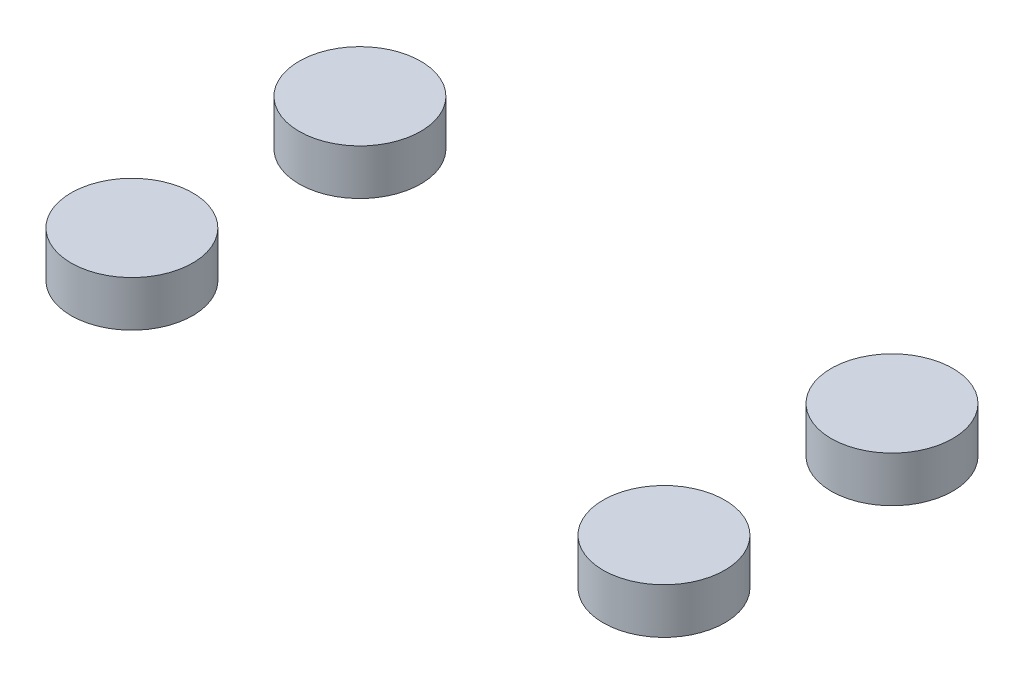
ISO-10303-21;
HEADER;
FILE_DESCRIPTION(('STEP AP214'),'2;1');
FILE_NAME('part.step','',(''),(''),'','','');
FILE_SCHEMA(('AUTOMOTIVE_DESIGN { 1 0 10303 214 1 1 1 1 }'));
ENDSEC;
DATA;
#1=APPLICATION_CONTEXT('core data for automotive mechanical design processes');
#2=APPLICATION_PROTOCOL_DEFINITION('international standard','automotive_design',2000,#1);
#3=PRODUCT_CONTEXT('',#1,'mechanical');
#4=PRODUCT('Part','Part','',(#3));
#5=PRODUCT_RELATED_PRODUCT_CATEGORY('part','',(#4));
#6=PRODUCT_DEFINITION_FORMATION('','',#4);
#7=PRODUCT_DEFINITION_CONTEXT('part definition',#1,'design');
#8=PRODUCT_DEFINITION('design','',#6,#7);
#9=PRODUCT_DEFINITION_SHAPE('','',#8);
#10=(LENGTH_UNIT() NAMED_UNIT(*) SI_UNIT(.MILLI.,.METRE.));
#11=(NAMED_UNIT(*) PLANE_ANGLE_UNIT() SI_UNIT($,.RADIAN.));
#12=(NAMED_UNIT(*) SI_UNIT($,.STERADIAN.) SOLID_ANGLE_UNIT());
#13=UNCERTAINTY_MEASURE_WITH_UNIT(LENGTH_MEASURE(1.E-05),#10,'distance_accuracy_value','');
#14=(GEOMETRIC_REPRESENTATION_CONTEXT(3) GLOBAL_UNCERTAINTY_ASSIGNED_CONTEXT((#13)) GLOBAL_UNIT_ASSIGNED_CONTEXT((#10,
#11,#12)) REPRESENTATION_CONTEXT('',''));
#15=CARTESIAN_POINT('',(0.,0.,0.));
#16=DIRECTION('',(0.,0.,1.));
#17=DIRECTION('',(1.,0.,0.));
#18=AXIS2_PLACEMENT_3D('',#15,#16,#17);
#19=CARTESIAN_POINT('',(700.,-20.0000000000001,-1340.));
#20=DIRECTION('',(0.,-1.,0.));
#21=DIRECTION('',(0.,0.,-1.));
#22=AXIS2_PLACEMENT_3D('',#19,#20,#21);
#23=CYLINDRICAL_SURFACE('',#22,160.);
#24=CARTESIAN_POINT('',(700.,-20.0000000000001,-1340.));
#25=DIRECTION('',(0.,1.,0.));
#26=DIRECTION('',(0.,0.,1.));
#27=AXIS2_PLACEMENT_3D('',#24,#25,#26);
#28=CIRCLE('',#27,160.);
#29=CARTESIAN_POINT('',(700.,-20.0000000000001,-1180.));
#30=VERTEX_POINT('',#29);
#31=EDGE_CURVE('E11',#30,#30,#28,.T.);
#32=ORIENTED_EDGE('',*,*,#31,.F.);
#33=EDGE_LOOP('',(#32));
#34=FACE_BOUND('',#33,.T.);
#35=CARTESIAN_POINT('',(700.,-140.,-1340.));
#36=DIRECTION('',(0.,1.,0.));
#37=DIRECTION('',(0.,0.,1.));
#38=AXIS2_PLACEMENT_3D('',#35,#36,#37);
#39=CIRCLE('',#38,160.);
#40=CARTESIAN_POINT('',(700.,-140.,-1180.));
#41=VERTEX_POINT('',#40);
#42=EDGE_CURVE('E47',#41,#41,#39,.T.);
#43=ORIENTED_EDGE('',*,*,#42,.T.);
#44=EDGE_LOOP('',(#43));
#45=FACE_BOUND('',#44,.T.);
#46=ADVANCED_FACE('F46',(#34,#45),#23,.T.);
#47=CARTESIAN_POINT('',(700.,-20.0000000000001,-1340.));
#48=DIRECTION('',(0.,1.,0.));
#49=DIRECTION('',(0.,0.,1.));
#50=AXIS2_PLACEMENT_3D('',#47,#48,#49);
#51=PLANE('',#50);
#52=ORIENTED_EDGE('',*,*,#31,.T.);
#53=EDGE_LOOP('',(#52));
#54=FACE_BOUND('',#53,.T.);
#55=ADVANCED_FACE('F61',(#54),#51,.T.);
#56=CARTESIAN_POINT('',(700.,-140.,-1340.));
#57=DIRECTION('',(0.,1.,0.));
#58=DIRECTION('',(0.,0.,1.));
#59=AXIS2_PLACEMENT_3D('',#56,#57,#58);
#60=PLANE('',#59);
#61=ORIENTED_EDGE('',*,*,#42,.F.);
#62=EDGE_LOOP('',(#61));
#63=FACE_BOUND('',#62,.T.);
#64=ADVANCED_FACE('F56',(#63),#60,.F.);
#65=CLOSED_SHELL('',(#46,#55,#64));
#66=MANIFOLD_SOLID_BREP('B2',#65);
#67=CARTESIAN_POINT('',(700.,-20.0000000000001,-1940.));
#68=DIRECTION('',(0.,-1.,0.));
#69=DIRECTION('',(0.,0.,-1.));
#70=AXIS2_PLACEMENT_3D('',#67,#68,#69);
#71=CYLINDRICAL_SURFACE('',#70,160.);
#72=CARTESIAN_POINT('',(700.,-20.0000000000001,-1940.));
#73=DIRECTION('',(0.,1.,0.));
#74=DIRECTION('',(0.,0.,1.));
#75=AXIS2_PLACEMENT_3D('',#72,#73,#74);
#76=CIRCLE('',#75,160.);
#77=CARTESIAN_POINT('',(700.,-20.0000000000001,-1780.));
#78=VERTEX_POINT('',#77);
#79=EDGE_CURVE('E44',#78,#78,#76,.T.);
#80=ORIENTED_EDGE('',*,*,#79,.F.);
#81=EDGE_LOOP('',(#80));
#82=FACE_BOUND('',#81,.T.);
#83=CARTESIAN_POINT('',(700.,-140.,-1940.));
#84=DIRECTION('',(0.,1.,0.));
#85=DIRECTION('',(0.,0.,1.));
#86=AXIS2_PLACEMENT_3D('',#83,#84,#85);
#87=CIRCLE('',#86,160.);
#88=CARTESIAN_POINT('',(700.,-140.,-1780.));
#89=VERTEX_POINT('',#88);
#90=EDGE_CURVE('E98',#89,#89,#87,.T.);
#91=ORIENTED_EDGE('',*,*,#90,.T.);
#92=EDGE_LOOP('',(#91));
#93=FACE_BOUND('',#92,.T.);
#94=ADVANCED_FACE('F92',(#82,#93),#71,.T.);
#95=CARTESIAN_POINT('',(700.,-20.0000000000001,-1940.));
#96=DIRECTION('',(0.,1.,0.));
#97=DIRECTION('',(0.,0.,1.));
#98=AXIS2_PLACEMENT_3D('',#95,#96,#97);
#99=PLANE('',#98);
#100=ORIENTED_EDGE('',*,*,#79,.T.);
#101=EDGE_LOOP('',(#100));
#102=FACE_BOUND('',#101,.T.);
#103=ADVANCED_FACE('F109',(#102),#99,.T.);
#104=CARTESIAN_POINT('',(700.,-140.,-1940.));
#105=DIRECTION('',(0.,1.,0.));
#106=DIRECTION('',(0.,0.,1.));
#107=AXIS2_PLACEMENT_3D('',#104,#105,#106);
#108=PLANE('',#107);
#109=ORIENTED_EDGE('',*,*,#90,.F.);
#110=EDGE_LOOP('',(#109));
#111=FACE_BOUND('',#110,.T.);
#112=ADVANCED_FACE('F107',(#111),#108,.F.);
#113=CLOSED_SHELL('',(#94,#103,#112));
#114=MANIFOLD_SOLID_BREP('B6',#113);
#115=CARTESIAN_POINT('',(-700.,-20.0000000000001,-1340.));
#116=DIRECTION('',(0.,-1.,0.));
#117=DIRECTION('',(0.,0.,-1.));
#118=AXIS2_PLACEMENT_3D('',#115,#116,#117);
#119=CYLINDRICAL_SURFACE('',#118,160.);
#120=CARTESIAN_POINT('',(-700.,-20.0000000000001,-1340.));
#121=DIRECTION('',(0.,1.,0.));
#122=DIRECTION('',(0.,0.,1.));
#123=AXIS2_PLACEMENT_3D('',#120,#121,#122);
#124=CIRCLE('',#123,160.);
#125=CARTESIAN_POINT('',(-700.,-20.0000000000001,-1180.));
#126=VERTEX_POINT('',#125);
#127=EDGE_CURVE('E94',#126,#126,#124,.T.);
#128=ORIENTED_EDGE('',*,*,#127,.F.);
#129=EDGE_LOOP('',(#128));
#130=FACE_BOUND('',#129,.T.);
#131=CARTESIAN_POINT('',(-700.,-140.,-1340.));
#132=DIRECTION('',(0.,1.,0.));
#133=DIRECTION('',(0.,0.,1.));
#134=AXIS2_PLACEMENT_3D('',#131,#132,#133);
#135=CIRCLE('',#134,160.);
#136=CARTESIAN_POINT('',(-700.,-140.,-1180.));
#137=VERTEX_POINT('',#136);
#138=EDGE_CURVE('E148',#137,#137,#135,.T.);
#139=ORIENTED_EDGE('',*,*,#138,.T.);
#140=EDGE_LOOP('',(#139));
#141=FACE_BOUND('',#140,.T.);
#142=ADVANCED_FACE('F141',(#130,#141),#119,.T.);
#143=CARTESIAN_POINT('',(-700.,-20.0000000000001,-1340.));
#144=DIRECTION('',(0.,1.,0.));
#145=DIRECTION('',(0.,0.,1.));
#146=AXIS2_PLACEMENT_3D('',#143,#144,#145);
#147=PLANE('',#146);
#148=ORIENTED_EDGE('',*,*,#127,.T.);
#149=EDGE_LOOP('',(#148));
#150=FACE_BOUND('',#149,.T.);
#151=ADVANCED_FACE('F158',(#150),#147,.T.);
#152=CARTESIAN_POINT('',(-700.,-140.,-1340.));
#153=DIRECTION('',(0.,1.,0.));
#154=DIRECTION('',(0.,0.,1.));
#155=AXIS2_PLACEMENT_3D('',#152,#153,#154);
#156=PLANE('',#155);
#157=ORIENTED_EDGE('',*,*,#138,.F.);
#158=EDGE_LOOP('',(#157));
#159=FACE_BOUND('',#158,.T.);
#160=ADVANCED_FACE('F156',(#159),#156,.F.);
#161=CLOSED_SHELL('',(#142,#151,#160));
#162=MANIFOLD_SOLID_BREP('B37',#161);
#163=CARTESIAN_POINT('',(-700.,-20.0000000000001,-1940.));
#164=DIRECTION('',(0.,-1.,0.));
#165=DIRECTION('',(0.,0.,-1.));
#166=AXIS2_PLACEMENT_3D('',#163,#164,#165);
#167=CYLINDRICAL_SURFACE('',#166,160.);
#168=CARTESIAN_POINT('',(-700.,-20.0000000000001,-1940.));
#169=DIRECTION('',(0.,1.,0.));
#170=DIRECTION('',(0.,0.,1.));
#171=AXIS2_PLACEMENT_3D('',#168,#169,#170);
#172=CIRCLE('',#171,160.);
#173=CARTESIAN_POINT('',(-700.,-20.0000000000001,-1780.));
#174=VERTEX_POINT('',#173);
#175=EDGE_CURVE('E142',#174,#174,#172,.T.);
#176=ORIENTED_EDGE('',*,*,#175,.F.);
#177=EDGE_LOOP('',(#176));
#178=FACE_BOUND('',#177,.T.);
#179=CARTESIAN_POINT('',(-700.,-140.,-1940.));
#180=DIRECTION('',(0.,1.,0.));
#181=DIRECTION('',(0.,0.,1.));
#182=AXIS2_PLACEMENT_3D('',#179,#180,#181);
#183=CIRCLE('',#182,160.);
#184=CARTESIAN_POINT('',(-700.,-140.,-1780.));
#185=VERTEX_POINT('',#184);
#186=EDGE_CURVE('E190',#185,#185,#183,.T.);
#187=ORIENTED_EDGE('',*,*,#186,.T.);
#188=EDGE_LOOP('',(#187));
#189=FACE_BOUND('',#188,.T.);
#190=ADVANCED_FACE('F184',(#178,#189),#167,.T.);
#191=CARTESIAN_POINT('',(-700.,-20.0000000000001,-1940.));
#192=DIRECTION('',(0.,1.,0.));
#193=DIRECTION('',(0.,0.,1.));
#194=AXIS2_PLACEMENT_3D('',#191,#192,#193);
#195=PLANE('',#194);
#196=ORIENTED_EDGE('',*,*,#175,.T.);
#197=EDGE_LOOP('',(#196));
#198=FACE_BOUND('',#197,.T.);
#199=ADVANCED_FACE('F200',(#198),#195,.T.);
#200=CARTESIAN_POINT('',(-700.,-140.,-1940.));
#201=DIRECTION('',(0.,1.,0.));
#202=DIRECTION('',(0.,0.,1.));
#203=AXIS2_PLACEMENT_3D('',#200,#201,#202);
#204=PLANE('',#203);
#205=ORIENTED_EDGE('',*,*,#186,.F.);
#206=EDGE_LOOP('',(#205));
#207=FACE_BOUND('',#206,.T.);
#208=ADVANCED_FACE('F197',(#207),#204,.F.);
#209=CLOSED_SHELL('',(#190,#199,#208));
#210=MANIFOLD_SOLID_BREP('B90',#209);
#211=ADVANCED_BREP_SHAPE_REPRESENTATION('',(#18,#66,#114,#162,#210),#14);
#212=SHAPE_DEFINITION_REPRESENTATION(#9,#211);
ENDSEC;
END-ISO-10303-21;
